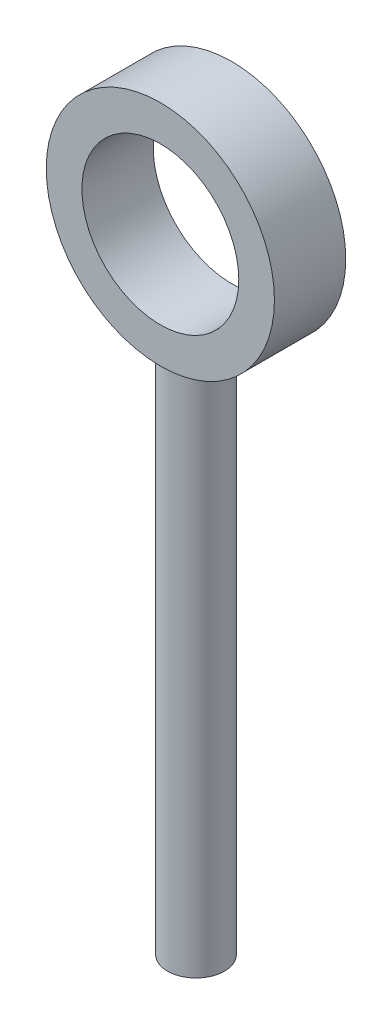
ISO-10303-21;
HEADER;
FILE_DESCRIPTION(('STEP AP214'),'2;1');
FILE_NAME('part.step','',(''),(''),'','','');
FILE_SCHEMA(('AUTOMOTIVE_DESIGN { 1 0 10303 214 1 1 1 1 }'));
ENDSEC;
DATA;
#1=APPLICATION_CONTEXT('core data for automotive mechanical design processes');
#2=APPLICATION_PROTOCOL_DEFINITION('international standard','automotive_design',2000,#1);
#3=PRODUCT_CONTEXT('',#1,'mechanical');
#4=PRODUCT('Part','Part','',(#3));
#5=PRODUCT_RELATED_PRODUCT_CATEGORY('part','',(#4));
#6=PRODUCT_DEFINITION_FORMATION('','',#4);
#7=PRODUCT_DEFINITION_CONTEXT('part definition',#1,'design');
#8=PRODUCT_DEFINITION('design','',#6,#7);
#9=PRODUCT_DEFINITION_SHAPE('','',#8);
#10=(LENGTH_UNIT() NAMED_UNIT(*) SI_UNIT(.MILLI.,.METRE.));
#11=(NAMED_UNIT(*) PLANE_ANGLE_UNIT() SI_UNIT($,.RADIAN.));
#12=(NAMED_UNIT(*) SI_UNIT($,.STERADIAN.) SOLID_ANGLE_UNIT());
#13=UNCERTAINTY_MEASURE_WITH_UNIT(LENGTH_MEASURE(1.E-05),#10,'distance_accuracy_value','');
#14=(GEOMETRIC_REPRESENTATION_CONTEXT(3) GLOBAL_UNCERTAINTY_ASSIGNED_CONTEXT((#13)) GLOBAL_UNIT_ASSIGNED_CONTEXT((#10,
#11,#12)) REPRESENTATION_CONTEXT('',''));
#15=CARTESIAN_POINT('',(0.,0.,0.));
#16=DIRECTION('',(0.,0.,1.));
#17=DIRECTION('',(1.,0.,0.));
#18=AXIS2_PLACEMENT_3D('',#15,#16,#17);
#19=CARTESIAN_POINT('',(0.,0.,2.5));
#20=DIRECTION('',(0.,0.,-1.));
#21=DIRECTION('',(-1.,0.,0.));
#22=AXIS2_PLACEMENT_3D('',#19,#20,#21);
#23=CYLINDRICAL_SURFACE('',#22,8.);
#24=CARTESIAN_POINT('',(0.,0.,2.5));
#25=DIRECTION('',(0.,0.,1.));
#26=DIRECTION('',(1.,0.,0.));
#27=AXIS2_PLACEMENT_3D('',#24,#25,#26);
#28=CIRCLE('',#27,8.);
#29=CARTESIAN_POINT('',(8.,0.,2.5));
#30=VERTEX_POINT('',#29);
#31=EDGE_CURVE('E46',#30,#30,#28,.T.);
#32=ORIENTED_EDGE('',*,*,#31,.F.);
#33=EDGE_LOOP('',(#32));
#34=FACE_BOUND('',#33,.T.);
#35=CARTESIAN_POINT('',(0.,0.,-2.5));
#36=DIRECTION('',(0.,0.,1.));
#37=DIRECTION('',(1.,0.,0.));
#38=AXIS2_PLACEMENT_3D('',#35,#36,#37);
#39=CIRCLE('',#38,8.);
#40=CARTESIAN_POINT('',(8.,0.,-2.5));
#41=VERTEX_POINT('',#40);
#42=EDGE_CURVE('E50',#41,#41,#39,.T.);
#43=ORIENTED_EDGE('',*,*,#42,.T.);
#44=EDGE_LOOP('',(#43));
#45=FACE_BOUND('',#44,.T.);
#46=CARTESIAN_POINT('',(0.,-8.,-2.));
#47=CARTESIAN_POINT('',(0.110501451559641,-7.99999813157349,-1.99999689901579));
#48=CARTESIAN_POINT('',(0.221037543774351,-7.99768770842435,-1.99081126563495));
#49=CARTESIAN_POINT('',(0.438941765027377,-7.98869485106526,-1.95436646492399));
#50=CARTESIAN_POINT('',(0.54630806249432,-7.98200993893301,-1.92709705394953));
#51=CARTESIAN_POINT('',(0.754694496243436,-7.96500835109376,-1.85541432871722));
#52=CARTESIAN_POINT('',(0.855722084573336,-7.95469603789411,-1.81102160171297));
#53=CARTESIAN_POINT('',(1.04889617587257,-7.93153791743495,-1.70642481327354));
#54=CARTESIAN_POINT('',(1.14104237913168,-7.91869202472209,-1.64622021850804));
#55=CARTESIAN_POINT('',(1.31573590306789,-7.89156551455591,-1.51039894712776));
#56=CARTESIAN_POINT('',(1.39807425341474,-7.87726276197502,-1.43451790005459));
#57=CARTESIAN_POINT('',(1.54899856960443,-7.84898160157248,-1.27006372678795));
#58=CARTESIAN_POINT('',(1.61758298259892,-7.83500323053157,-1.18148916940408));
#59=CARTESIAN_POINT('',(1.74003539039863,-7.80873034264225,-0.992539697684011));
#60=CARTESIAN_POINT('',(1.79366962123352,-7.79646392619748,-0.892009025588361));
#61=CARTESIAN_POINT('',(1.88319587806766,-7.77532659757355,-0.683002117786618));
#62=CARTESIAN_POINT('',(1.91909074058685,-7.76645514259224,-0.574527155557312));
#63=CARTESIAN_POINT('',(1.97140644907302,-7.7533396892843,-0.355008669064452));
#64=CARTESIAN_POINT('',(1.98820302444274,-7.74900654662681,-0.244060138616009));
#65=CARTESIAN_POINT('',(2.00301570008854,-7.74519149946122,-0.0208419080008717));
#66=CARTESIAN_POINT('',(2.00103485575748,-7.74570880570571,0.0914275742561837));
#67=CARTESIAN_POINT('',(1.97864869951961,-7.75145607355756,0.311221076993805));
#68=CARTESIAN_POINT('',(1.95869112025418,-7.75657150676391,0.418794161953775));
#69=CARTESIAN_POINT('',(1.90163224920399,-7.77075612894758,0.629014734548079));
#70=CARTESIAN_POINT('',(1.86452973609252,-7.77982559958985,0.731661870705229));
#71=CARTESIAN_POINT('',(1.77385263724958,-7.80100151874212,0.93031735500284));
#72=CARTESIAN_POINT('',(1.72011555631056,-7.81313769959755,1.02624822905276));
#73=CARTESIAN_POINT('',(1.59780836801993,-7.83906281127988,1.20789161300909));
#74=CARTESIAN_POINT('',(1.52923566507845,-7.85285203112837,1.29360233075633));
#75=CARTESIAN_POINT('',(1.37688456624163,-7.88101174053188,1.45493815425921));
#76=CARTESIAN_POINT('',(1.29272834422115,-7.89538759304001,1.53020598674847));
#77=CARTESIAN_POINT('',(1.11281589000493,-7.92274620771675,1.6656283232852));
#78=CARTESIAN_POINT('',(1.01705930361059,-7.93572892732543,1.72578236568475));
#79=CARTESIAN_POINT('',(0.816154518241856,-7.9589030945892,1.82940078163251));
#80=CARTESIAN_POINT('',(0.710975190944831,-7.96908480170303,1.87280712033924));
#81=CARTESIAN_POINT('',(0.49450134419051,-7.98543889321888,1.94122307427943));
#82=CARTESIAN_POINT('',(0.383207998867313,-7.99161204452374,1.96623620855752));
#83=CARTESIAN_POINT('',(0.160719960520036,-7.999139990285,1.99661008741178));
#84=CARTESIAN_POINT('',(0.0495956266509461,-8.00061404677705,2.0024573681004));
#85=CARTESIAN_POINT('',(-0.172043833068678,-7.99891739752601,1.99566799725935));
#86=CARTESIAN_POINT('',(-0.28255901285946,-7.99574710989128,1.98303300960116));
#87=CARTESIAN_POINT('',(-0.498152358368656,-7.98519441503143,1.94003878881149));
#88=CARTESIAN_POINT('',(-0.603286825291673,-7.97787512247748,1.90994498203068));
#89=CARTESIAN_POINT('',(-0.807009723270016,-7.95984942178845,1.83319055462874));
#90=CARTESIAN_POINT('',(-0.905597492043513,-7.94914267159856,1.78652826091577));
#91=CARTESIAN_POINT('',(-1.0953641792398,-7.92524410568414,1.6770184948337));
#92=CARTESIAN_POINT('',(-1.18638058911444,-7.91201156489243,1.61389851680432));
#93=CARTESIAN_POINT('',(-1.35670215152433,-7.88459345583226,1.47361345493737));
#94=CARTESIAN_POINT('',(-1.43600527863068,-7.87040772335606,1.39644594717746));
#95=CARTESIAN_POINT('',(-1.58265409076364,-7.84225275947695,1.22799738554071));
#96=CARTESIAN_POINT('',(-1.64965849016271,-7.82829738916375,1.13641639599677));
#97=CARTESIAN_POINT('',(-1.7673476786836,-7.80257171169652,0.94302315404571));
#98=CARTESIAN_POINT('',(-1.81803319221058,-7.79080130756035,0.841211356053661));
#99=CARTESIAN_POINT('',(-1.90126856081239,-7.77090792979553,0.630792370115894));
#100=CARTESIAN_POINT('',(-1.93392586220542,-7.76276340389207,0.522229828874653));
#101=CARTESIAN_POINT('',(-1.98046087993837,-7.75102325453578,0.30092048281452));
#102=CARTESIAN_POINT('',(-1.99434270330488,-7.74742663626582,0.188174598623344));
#103=CARTESIAN_POINT('',(-2.00271812044533,-7.74526534938609,-0.0348280318069379));
#104=CARTESIAN_POINT('',(-1.99775719704016,-7.74655910304351,-0.145063246832975));
#105=CARTESIAN_POINT('',(-1.96983637108382,-7.7537054534379,-0.363071851557308));
#106=CARTESIAN_POINT('',(-1.94687683024902,-7.75955795855809,-0.470845290684868));
#107=CARTESIAN_POINT('',(-1.88390842592373,-7.77508347576963,-0.680277945420545));
#108=CARTESIAN_POINT('',(-1.84400187290717,-7.78473353648412,-0.781969740320277));
#109=CARTESIAN_POINT('',(-1.74835321814009,-7.80677007633105,-0.977287176951585));
#110=CARTESIAN_POINT('',(-1.69260892004558,-7.81915693494364,-1.07091169758255));
#111=CARTESIAN_POINT('',(-1.56515699818285,-7.8456751235135,-1.25007283866936));
#112=CARTESIAN_POINT('',(-1.49307088388301,-7.85984353109009,-1.33533476456528));
#113=CARTESIAN_POINT('',(-1.33571916158631,-7.88810702995047,-1.49272939306054));
#114=CARTESIAN_POINT('',(-1.25045042834819,-7.90220210302746,-1.56485897348396));
#115=CARTESIAN_POINT('',(-1.06729011560345,-7.92903540863551,-1.69521507808614));
#116=CARTESIAN_POINT('',(-0.969197896421849,-7.94174444487824,-1.75316615156211));
#117=CARTESIAN_POINT('',(-0.764354746013968,-7.96406566633491,-1.85166328392071));
#118=CARTESIAN_POINT('',(-0.657610084582319,-7.97368006933042,-1.89222181419805));
#119=CARTESIAN_POINT('',(-0.459213670991296,-7.98730746087389,-1.94876244043954));
#120=CARTESIAN_POINT('',(-0.368506894544092,-7.99203446736921,-1.96793499073791));
#121=CARTESIAN_POINT('',(-0.185208095381711,-7.99838140309264,-1.99355459149592));
#122=CARTESIAN_POINT('',(-0.0926162149901553,-8.00000156601192,-2.00000259907373));
#123=CARTESIAN_POINT('',(0.,-8.,-2.));
#124=B_SPLINE_CURVE_WITH_KNOTS('',3,(#46,#47,#48,#49,#50,#51,#52,#53,#54,#55,#56,#57,#58,#59,
#60,#61,#62,#63,#64,#65,#66,#67,#68,#69,#70,#71,#72,#73,#74,#75,#76,#77,#78,#79,#80,#81,#82,#83,
#84,#85,#86,#87,#88,#89,#90,#91,#92,#93,#94,#95,#96,#97,#98,#99,#100,#101,#102,#103,#104,#105,
#106,#107,#108,#109,#110,#111,#112,#113,#114,#115,#116,#117,#118,#119,#120,#121,#122,#123),
.UNSPECIFIED.,.T.,.F.,(4,2,2,2,2,2,2,2,2,2,2,2,2,2,2,2,2,2,2,2,2,2,2,2,2,2,2,2,2,2,2,2,2,2,2,2,
2,2,4),(0.,0.33116494996252,0.662517650351866,0.993473203048141,1.32443992022577,
1.66152580582852,1.99864972773416,2.34078196727743,2.68285948225825,3.01808393468093,
3.3532538415469,3.68029996013785,4.00736937959146,4.337740371696,4.66816921119311,
5.00802001296453,5.34788119415424,5.6889097201658,6.02987298255951,6.36211078603463,
6.69431868154751,7.02160366023144,7.34892169767482,7.68204783424897,8.01523150681786,
8.35659345610395,8.69794025003772,9.03723006156476,9.37644564340971,9.70591707202578,
10.0353818794581,10.3628853408369,10.6904342418696,11.0265276855097,11.3627009303165,
11.7049624733721,12.0469781843289,12.3245632392729,12.6021274139515),.UNSPECIFIED.);
#125=CARTESIAN_POINT('',(0.,-8.,-2.));
#126=VERTEX_POINT('',#125);
#127=EDGE_CURVE('E10',#126,#126,#124,.T.);
#128=ORIENTED_EDGE('',*,*,#127,.F.);
#129=EDGE_LOOP('',(#128));
#130=FACE_BOUND('',#129,.T.);
#131=ADVANCED_FACE('F35',(#34,#45,#130),#23,.T.);
#132=CARTESIAN_POINT('',(0.,0.,2.5));
#133=DIRECTION('',(0.,0.,1.));
#134=DIRECTION('',(1.,0.,0.));
#135=AXIS2_PLACEMENT_3D('',#132,#133,#134);
#136=PLANE('',#135);
#137=ORIENTED_EDGE('',*,*,#31,.T.);
#138=EDGE_LOOP('',(#137));
#139=FACE_BOUND('',#138,.T.);
#140=CARTESIAN_POINT('',(0.,0.,2.5));
#141=DIRECTION('',(0.,0.,1.));
#142=DIRECTION('',(1.,0.,0.));
#143=AXIS2_PLACEMENT_3D('',#140,#141,#142);
#144=CIRCLE('',#143,5.5);
#145=CARTESIAN_POINT('',(5.5,0.,2.5));
#146=VERTEX_POINT('',#145);
#147=EDGE_CURVE('E55',#146,#146,#144,.T.);
#148=ORIENTED_EDGE('',*,*,#147,.F.);
#149=EDGE_LOOP('',(#148));
#150=FACE_BOUND('',#149,.T.);
#151=ADVANCED_FACE('F80',(#139,#150),#136,.T.);
#152=CARTESIAN_POINT('',(0.,0.,-2.5));
#153=DIRECTION('',(0.,0.,1.));
#154=DIRECTION('',(1.,0.,0.));
#155=AXIS2_PLACEMENT_3D('',#152,#153,#154);
#156=PLANE('',#155);
#157=ORIENTED_EDGE('',*,*,#42,.F.);
#158=EDGE_LOOP('',(#157));
#159=FACE_BOUND('',#158,.T.);
#160=CARTESIAN_POINT('',(0.,0.,-2.5));
#161=DIRECTION('',(0.,0.,1.));
#162=DIRECTION('',(1.,0.,0.));
#163=AXIS2_PLACEMENT_3D('',#160,#161,#162);
#164=CIRCLE('',#163,5.5);
#165=CARTESIAN_POINT('',(5.5,0.,-2.5));
#166=VERTEX_POINT('',#165);
#167=EDGE_CURVE('E57',#166,#166,#164,.T.);
#168=ORIENTED_EDGE('',*,*,#167,.T.);
#169=EDGE_LOOP('',(#168));
#170=FACE_BOUND('',#169,.T.);
#171=ADVANCED_FACE('F76',(#159,#170),#156,.F.);
#172=CARTESIAN_POINT('',(0.,0.,2.5));
#173=DIRECTION('',(0.,0.,-1.));
#174=DIRECTION('',(-1.,0.,0.));
#175=AXIS2_PLACEMENT_3D('',#172,#173,#174);
#176=CYLINDRICAL_SURFACE('',#175,5.5);
#177=ORIENTED_EDGE('',*,*,#147,.T.);
#178=EDGE_LOOP('',(#177));
#179=FACE_BOUND('',#178,.T.);
#180=ORIENTED_EDGE('',*,*,#167,.F.);
#181=EDGE_LOOP('',(#180));
#182=FACE_BOUND('',#181,.T.);
#183=ADVANCED_FACE('F70',(#179,#182),#176,.F.);
#184=CARTESIAN_POINT('',(0.,-45.,0.));
#185=DIRECTION('',(0.,1.,0.));
#186=DIRECTION('',(0.,0.,1.));
#187=AXIS2_PLACEMENT_3D('',#184,#185,#186);
#188=PLANE('',#187);
#189=CARTESIAN_POINT('',(0.,-45.,0.));
#190=DIRECTION('',(0.,1.,0.));
#191=DIRECTION('',(0.,0.,1.));
#192=AXIS2_PLACEMENT_3D('',#189,#190,#191);
#193=CIRCLE('',#192,2.);
#194=CARTESIAN_POINT('',(0.,-45.,2.));
#195=VERTEX_POINT('',#194);
#196=EDGE_CURVE('E60',#195,#195,#193,.T.);
#197=ORIENTED_EDGE('',*,*,#196,.F.);
#198=EDGE_LOOP('',(#197));
#199=FACE_BOUND('',#198,.T.);
#200=ADVANCED_FACE('F68',(#199),#188,.F.);
#201=CARTESIAN_POINT('',(0.,8.001,0.));
#202=DIRECTION('',(0.,-1.,0.));
#203=DIRECTION('',(0.,0.,-1.));
#204=AXIS2_PLACEMENT_3D('',#201,#202,#203);
#205=CYLINDRICAL_SURFACE('',#204,2.);
#206=ORIENTED_EDGE('',*,*,#196,.T.);
#207=EDGE_LOOP('',(#206));
#208=FACE_BOUND('',#207,.T.);
#209=ORIENTED_EDGE('',*,*,#127,.T.);
#210=EDGE_LOOP('',(#209));
#211=FACE_BOUND('',#210,.T.);
#212=ADVANCED_FACE('F66',(#208,#211),#205,.T.);
#213=CLOSED_SHELL('',(#131,#151,#171,#183,#200,#212));
#214=MANIFOLD_SOLID_BREP('B2',#213);
#215=ADVANCED_BREP_SHAPE_REPRESENTATION('',(#18,#214),#14);
#216=SHAPE_DEFINITION_REPRESENTATION(#9,#215);
ENDSEC;
END-ISO-10303-21;
